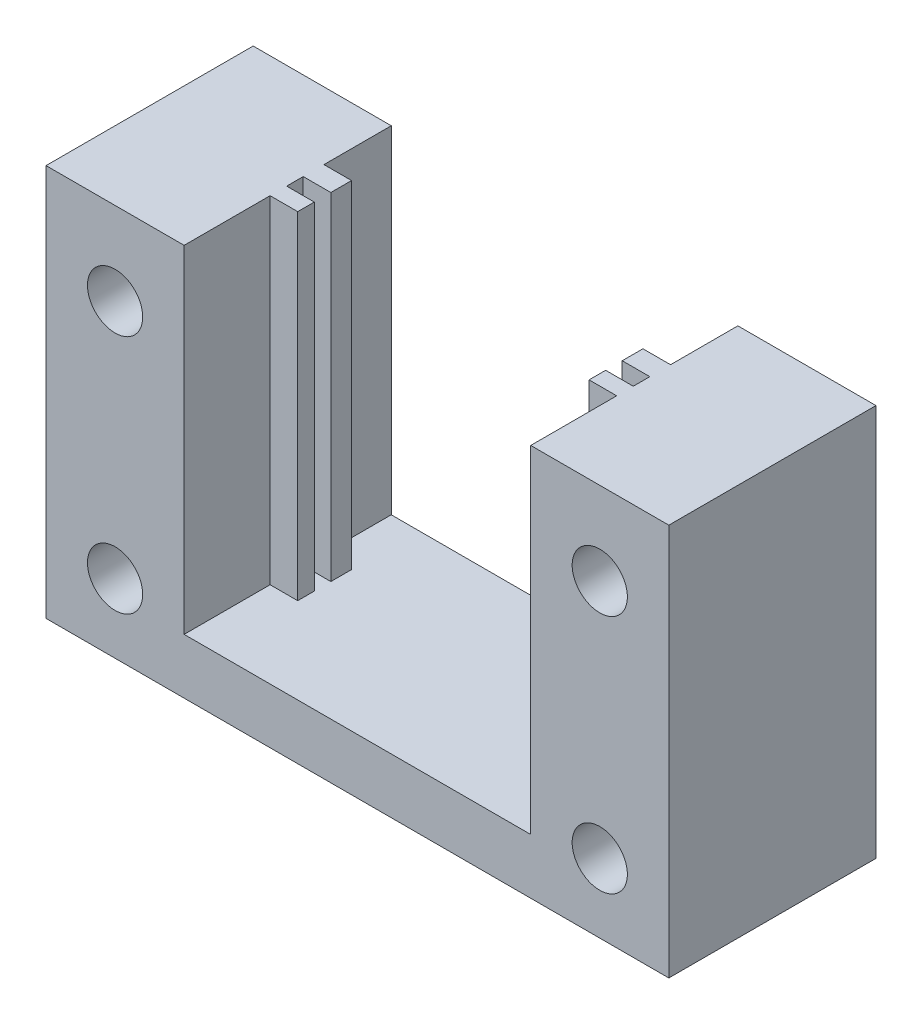
ISO-10303-21;
HEADER;
FILE_DESCRIPTION(('STEP AP214'),'2;1');
FILE_NAME('part.step','',(''),(''),'','','');
FILE_SCHEMA(('AUTOMOTIVE_DESIGN { 1 0 10303 214 1 1 1 1 }'));
ENDSEC;
DATA;
#1=APPLICATION_CONTEXT('core data for automotive mechanical design processes');
#2=APPLICATION_PROTOCOL_DEFINITION('international standard','automotive_design',2000,#1);
#3=PRODUCT_CONTEXT('',#1,'mechanical');
#4=PRODUCT('Part','Part','',(#3));
#5=PRODUCT_RELATED_PRODUCT_CATEGORY('part','',(#4));
#6=PRODUCT_DEFINITION_FORMATION('','',#4);
#7=PRODUCT_DEFINITION_CONTEXT('part definition',#1,'design');
#8=PRODUCT_DEFINITION('design','',#6,#7);
#9=PRODUCT_DEFINITION_SHAPE('','',#8);
#10=(LENGTH_UNIT() NAMED_UNIT(*) SI_UNIT(.MILLI.,.METRE.));
#11=(NAMED_UNIT(*) PLANE_ANGLE_UNIT() SI_UNIT($,.RADIAN.));
#12=(NAMED_UNIT(*) SI_UNIT($,.STERADIAN.) SOLID_ANGLE_UNIT());
#13=UNCERTAINTY_MEASURE_WITH_UNIT(LENGTH_MEASURE(1.E-05),#10,'distance_accuracy_value','');
#14=(GEOMETRIC_REPRESENTATION_CONTEXT(3) GLOBAL_UNCERTAINTY_ASSIGNED_CONTEXT((#13)) GLOBAL_UNIT_ASSIGNED_CONTEXT((#10,
#11,#12)) REPRESENTATION_CONTEXT('',''));
#15=CARTESIAN_POINT('',(0.,0.,0.));
#16=DIRECTION('',(0.,0.,1.));
#17=DIRECTION('',(1.,0.,0.));
#18=AXIS2_PLACEMENT_3D('',#15,#16,#17);
#19=CARTESIAN_POINT('',(-17.55,8.9,-47.));
#20=DIRECTION('',(0.,0.,1.));
#21=DIRECTION('',(1.,0.,0.));
#22=AXIS2_PLACEMENT_3D('',#19,#20,#21);
#23=CYLINDRICAL_SURFACE('',#22,2.);
#24=CARTESIAN_POINT('',(-17.55,8.9,0.));
#25=DIRECTION('',(0.,0.,1.));
#26=DIRECTION('',(1.,0.,0.));
#27=AXIS2_PLACEMENT_3D('',#24,#25,#26);
#28=CIRCLE('',#27,2.);
#29=CARTESIAN_POINT('',(-15.55,8.9,0.));
#30=VERTEX_POINT('',#29);
#31=EDGE_CURVE('E690',#30,#30,#28,.F.);
#32=ORIENTED_EDGE('',*,*,#31,.F.);
#33=EDGE_LOOP('',(#32));
#34=FACE_BOUND('',#33,.T.);
#35=CARTESIAN_POINT('',(-17.55,8.9,-12.));
#36=DIRECTION('',(0.,0.,-1.));
#37=DIRECTION('',(-1.,0.,0.));
#38=AXIS2_PLACEMENT_3D('',#35,#36,#37);
#39=CIRCLE('',#38,2.);
#40=CARTESIAN_POINT('',(-19.55,8.9,-12.));
#41=VERTEX_POINT('',#40);
#42=EDGE_CURVE('E39',#41,#41,#39,.F.);
#43=ORIENTED_EDGE('',*,*,#42,.F.);
#44=EDGE_LOOP('',(#43));
#45=FACE_BOUND('',#44,.T.);
#46=ADVANCED_FACE('F35',(#34,#45),#23,.F.);
#47=CARTESIAN_POINT('',(-17.55,-8.5,-47.));
#48=DIRECTION('',(0.,0.,1.));
#49=DIRECTION('',(1.,0.,0.));
#50=AXIS2_PLACEMENT_3D('',#47,#48,#49);
#51=CYLINDRICAL_SURFACE('',#50,2.);
#52=CARTESIAN_POINT('',(-17.55,-8.5,0.));
#53=DIRECTION('',(0.,0.,1.));
#54=DIRECTION('',(1.,0.,0.));
#55=AXIS2_PLACEMENT_3D('',#52,#53,#54);
#56=CIRCLE('',#55,2.);
#57=CARTESIAN_POINT('',(-15.55,-8.5,0.));
#58=VERTEX_POINT('',#57);
#59=EDGE_CURVE('E687',#58,#58,#56,.F.);
#60=ORIENTED_EDGE('',*,*,#59,.F.);
#61=EDGE_LOOP('',(#60));
#62=FACE_BOUND('',#61,.T.);
#63=CARTESIAN_POINT('',(-17.55,-8.5,-12.));
#64=DIRECTION('',(0.,0.,-1.));
#65=DIRECTION('',(-1.,0.,0.));
#66=AXIS2_PLACEMENT_3D('',#63,#64,#65);
#67=CIRCLE('',#66,2.);
#68=CARTESIAN_POINT('',(-19.55,-8.5,-12.));
#69=VERTEX_POINT('',#68);
#70=EDGE_CURVE('E257',#69,#69,#67,.F.);
#71=ORIENTED_EDGE('',*,*,#70,.F.);
#72=EDGE_LOOP('',(#71));
#73=FACE_BOUND('',#72,.T.);
#74=ADVANCED_FACE('F267',(#62,#73),#51,.F.);
#75=CARTESIAN_POINT('',(17.55,-8.5,-47.));
#76=DIRECTION('',(0.,0.,1.));
#77=DIRECTION('',(1.,0.,0.));
#78=AXIS2_PLACEMENT_3D('',#75,#76,#77);
#79=CYLINDRICAL_SURFACE('',#78,2.);
#80=CARTESIAN_POINT('',(17.55,-8.5,0.));
#81=DIRECTION('',(0.,0.,1.));
#82=DIRECTION('',(1.,0.,0.));
#83=AXIS2_PLACEMENT_3D('',#80,#81,#82);
#84=CIRCLE('',#83,2.);
#85=CARTESIAN_POINT('',(19.55,-8.5,0.));
#86=VERTEX_POINT('',#85);
#87=EDGE_CURVE('E250',#86,#86,#84,.F.);
#88=ORIENTED_EDGE('',*,*,#87,.F.);
#89=EDGE_LOOP('',(#88));
#90=FACE_BOUND('',#89,.T.);
#91=CARTESIAN_POINT('',(17.55,-8.5,-12.));
#92=DIRECTION('',(0.,0.,-1.));
#93=DIRECTION('',(-1.,0.,0.));
#94=AXIS2_PLACEMENT_3D('',#91,#92,#93);
#95=CIRCLE('',#94,2.);
#96=CARTESIAN_POINT('',(15.55,-8.5,-12.));
#97=VERTEX_POINT('',#96);
#98=EDGE_CURVE('E254',#97,#97,#95,.F.);
#99=ORIENTED_EDGE('',*,*,#98,.F.);
#100=EDGE_LOOP('',(#99));
#101=FACE_BOUND('',#100,.T.);
#102=ADVANCED_FACE('F273',(#90,#101),#79,.F.);
#103=CARTESIAN_POINT('',(17.55,8.9,-47.));
#104=DIRECTION('',(0.,0.,1.));
#105=DIRECTION('',(1.,0.,0.));
#106=AXIS2_PLACEMENT_3D('',#103,#104,#105);
#107=CYLINDRICAL_SURFACE('',#106,2.);
#108=CARTESIAN_POINT('',(17.55,8.9,0.));
#109=DIRECTION('',(0.,0.,1.));
#110=DIRECTION('',(1.,0.,0.));
#111=AXIS2_PLACEMENT_3D('',#108,#109,#110);
#112=CIRCLE('',#111,2.);
#113=CARTESIAN_POINT('',(19.55,8.9,0.));
#114=VERTEX_POINT('',#113);
#115=EDGE_CURVE('E247',#114,#114,#112,.F.);
#116=ORIENTED_EDGE('',*,*,#115,.F.);
#117=EDGE_LOOP('',(#116));
#118=FACE_BOUND('',#117,.T.);
#119=CARTESIAN_POINT('',(17.55,8.9,-12.));
#120=DIRECTION('',(0.,0.,-1.));
#121=DIRECTION('',(-1.,0.,0.));
#122=AXIS2_PLACEMENT_3D('',#119,#120,#121);
#123=CIRCLE('',#122,2.);
#124=CARTESIAN_POINT('',(15.55,8.9,-12.));
#125=VERTEX_POINT('',#124);
#126=EDGE_CURVE('E251',#125,#125,#123,.F.);
#127=ORIENTED_EDGE('',*,*,#126,.F.);
#128=EDGE_LOOP('',(#127));
#129=FACE_BOUND('',#128,.T.);
#130=ADVANCED_FACE('F279',(#118,#129),#107,.F.);
#131=CARTESIAN_POINT('',(0.,-9.5,-15.));
#132=DIRECTION('',(0.,1.,0.));
#133=DIRECTION('',(0.,0.,1.));
#134=AXIS2_PLACEMENT_3D('',#131,#132,#133);
#135=PLANE('',#134);
#136=DIRECTION('',(0.,0.,1.));
#137=VECTOR('',#136,1.);
#138=CARTESIAN_POINT('',(10.55,-9.50000000000001,-7.425));
#139=LINE('',#138,#137);
#140=CARTESIAN_POINT('',(10.55,-9.50000000000001,-7.425));
#141=VERTEX_POINT('',#140);
#142=CARTESIAN_POINT('',(10.55,-9.50000000000001,-6.225));
#143=VERTEX_POINT('',#142);
#144=EDGE_CURVE('E696',#141,#143,#139,.T.);
#145=ORIENTED_EDGE('',*,*,#144,.F.);
#146=DIRECTION('',(1.,0.,0.));
#147=VECTOR('',#146,1.);
#148=CARTESIAN_POINT('',(10.55,-9.50000000000001,-7.425));
#149=LINE('',#148,#147);
#150=CARTESIAN_POINT('',(12.55,-9.50000000000001,-7.425));
#151=VERTEX_POINT('',#150);
#152=EDGE_CURVE('E453',#141,#151,#149,.T.);
#153=ORIENTED_EDGE('',*,*,#152,.T.);
#154=DIRECTION('',(0.,0.,1.));
#155=VECTOR('',#154,1.);
#156=CARTESIAN_POINT('',(12.55,-9.5,-15.));
#157=LINE('',#156,#155);
#158=CARTESIAN_POINT('',(12.55,-9.5,-8.625));
#159=VERTEX_POINT('',#158);
#160=EDGE_CURVE('E406',#159,#151,#157,.T.);
#161=ORIENTED_EDGE('',*,*,#160,.F.);
#162=DIRECTION('',(1.,0.,0.));
#163=VECTOR('',#162,1.);
#164=CARTESIAN_POINT('',(10.55,-9.5,-8.625));
#165=LINE('',#164,#163);
#166=CARTESIAN_POINT('',(10.55,-9.5,-8.625));
#167=VERTEX_POINT('',#166);
#168=EDGE_CURVE('E467',#167,#159,#165,.T.);
#169=ORIENTED_EDGE('',*,*,#168,.F.);
#170=DIRECTION('',(0.,0.,1.));
#171=VECTOR('',#170,1.);
#172=CARTESIAN_POINT('',(10.55,-9.50000000000001,-10.125));
#173=LINE('',#172,#171);
#174=CARTESIAN_POINT('',(10.55,-9.50000000000001,-10.125));
#175=VERTEX_POINT('',#174);
#176=EDGE_CURVE('E710',#175,#167,#173,.T.);
#177=ORIENTED_EDGE('',*,*,#176,.F.);
#178=DIRECTION('',(1.,0.,0.));
#179=VECTOR('',#178,1.);
#180=CARTESIAN_POINT('',(10.55,-9.50000000000001,-10.125));
#181=LINE('',#180,#179);
#182=CARTESIAN_POINT('',(12.55,-9.50000000000001,-10.125));
#183=VERTEX_POINT('',#182);
#184=EDGE_CURVE('E469',#175,#183,#181,.T.);
#185=ORIENTED_EDGE('',*,*,#184,.T.);
#186=CARTESIAN_POINT('',(12.55,-9.5,-15.));
#187=VERTEX_POINT('',#186);
#188=EDGE_CURVE('E403',#187,#183,#157,.T.);
#189=ORIENTED_EDGE('',*,*,#188,.F.);
#190=DIRECTION('',(-1.,0.,0.));
#191=VECTOR('',#190,1.);
#192=CARTESIAN_POINT('',(0.,-9.5,-15.));
#193=LINE('',#192,#191);
#194=CARTESIAN_POINT('',(-12.55,-9.5,-15.));
#195=VERTEX_POINT('',#194);
#196=EDGE_CURVE('E383',#187,#195,#193,.T.);
#197=ORIENTED_EDGE('',*,*,#196,.T.);
#198=DIRECTION('',(0.,0.,1.));
#199=VECTOR('',#198,1.);
#200=CARTESIAN_POINT('',(-12.55,-9.5,-15.));
#201=LINE('',#200,#199);
#202=CARTESIAN_POINT('',(-12.55,-9.5,-10.125));
#203=VERTEX_POINT('',#202);
#204=EDGE_CURVE('E407',#195,#203,#201,.T.);
#205=ORIENTED_EDGE('',*,*,#204,.T.);
#206=DIRECTION('',(-1.,0.,0.));
#207=VECTOR('',#206,1.);
#208=CARTESIAN_POINT('',(0.,-9.5,-10.125));
#209=LINE('',#208,#207);
#210=CARTESIAN_POINT('',(-10.55,-9.5,-10.125));
#211=VERTEX_POINT('',#210);
#212=EDGE_CURVE('E482',#211,#203,#209,.T.);
#213=ORIENTED_EDGE('',*,*,#212,.F.);
#214=DIRECTION('',(0.,0.,-1.));
#215=VECTOR('',#214,1.);
#216=CARTESIAN_POINT('',(-10.55,-9.5,-15.));
#217=LINE('',#216,#215);
#218=CARTESIAN_POINT('',(-10.55,-9.5,-8.625));
#219=VERTEX_POINT('',#218);
#220=EDGE_CURVE('E438',#219,#211,#217,.T.);
#221=ORIENTED_EDGE('',*,*,#220,.F.);
#222=DIRECTION('',(-1.,0.,0.));
#223=VECTOR('',#222,1.);
#224=CARTESIAN_POINT('',(0.,-9.5,-8.625));
#225=LINE('',#224,#223);
#226=CARTESIAN_POINT('',(-12.55,-9.5,-8.625));
#227=VERTEX_POINT('',#226);
#228=EDGE_CURVE('E490',#219,#227,#225,.T.);
#229=ORIENTED_EDGE('',*,*,#228,.T.);
#230=CARTESIAN_POINT('',(-12.55,-9.5,-7.425));
#231=VERTEX_POINT('',#230);
#232=EDGE_CURVE('E409',#227,#231,#201,.T.);
#233=ORIENTED_EDGE('',*,*,#232,.T.);
#234=DIRECTION('',(-1.,0.,0.));
#235=VECTOR('',#234,1.);
#236=CARTESIAN_POINT('',(0.,-9.5,-7.425));
#237=LINE('',#236,#235);
#238=CARTESIAN_POINT('',(-10.55,-9.5,-7.425));
#239=VERTEX_POINT('',#238);
#240=EDGE_CURVE('E44',#239,#231,#237,.T.);
#241=ORIENTED_EDGE('',*,*,#240,.F.);
#242=DIRECTION('',(0.,0.,1.));
#243=VECTOR('',#242,1.);
#244=CARTESIAN_POINT('',(-10.55,-9.5,-15.));
#245=LINE('',#244,#243);
#246=CARTESIAN_POINT('',(-10.55,-9.5,-6.225));
#247=VERTEX_POINT('',#246);
#248=EDGE_CURVE('E242',#239,#247,#245,.T.);
#249=ORIENTED_EDGE('',*,*,#248,.T.);
#250=DIRECTION('',(-1.,0.,0.));
#251=VECTOR('',#250,1.);
#252=CARTESIAN_POINT('',(0.,-9.5,-6.225));
#253=LINE('',#252,#251);
#254=CARTESIAN_POINT('',(-12.55,-9.5,-6.225));
#255=VERTEX_POINT('',#254);
#256=EDGE_CURVE('E11',#247,#255,#253,.T.);
#257=ORIENTED_EDGE('',*,*,#256,.T.);
#258=CARTESIAN_POINT('',(-12.55,-9.5,0.));
#259=VERTEX_POINT('',#258);
#260=EDGE_CURVE('E405',#255,#259,#201,.T.);
#261=ORIENTED_EDGE('',*,*,#260,.T.);
#262=DIRECTION('',(-1.,0.,0.));
#263=VECTOR('',#262,1.);
#264=CARTESIAN_POINT('',(0.,-9.5,0.));
#265=LINE('',#264,#263);
#266=CARTESIAN_POINT('',(12.55,-9.5,0.));
#267=VERTEX_POINT('',#266);
#268=EDGE_CURVE('E394',#267,#259,#265,.T.);
#269=ORIENTED_EDGE('',*,*,#268,.F.);
#270=CARTESIAN_POINT('',(12.55,-9.50000000000001,-6.225));
#271=VERTEX_POINT('',#270);
#272=EDGE_CURVE('E401',#271,#267,#157,.T.);
#273=ORIENTED_EDGE('',*,*,#272,.F.);
#274=DIRECTION('',(1.,0.,0.));
#275=VECTOR('',#274,1.);
#276=CARTESIAN_POINT('',(10.55,-9.50000000000001,-6.225));
#277=LINE('',#276,#275);
#278=EDGE_CURVE('E458',#143,#271,#277,.T.);
#279=ORIENTED_EDGE('',*,*,#278,.F.);
#280=EDGE_LOOP('',(#145,#153,#161,#169,#177,#185,#189,#197,#205,#213,#221,#229,#233,#241,#249,
#257,#261,#269,#273,#279));
#281=FACE_BOUND('',#280,.T.);
#282=ADVANCED_FACE('F341',(#281),#135,.T.);
#283=CARTESIAN_POINT('',(12.55,0.,-15.));
#284=DIRECTION('',(-1.,0.,0.));
#285=DIRECTION('',(0.,-1.,0.));
#286=AXIS2_PLACEMENT_3D('',#283,#284,#285);
#287=PLANE('',#286);
#288=ORIENTED_EDGE('',*,*,#160,.T.);
#289=DIRECTION('',(0.,-1.,0.));
#290=VECTOR('',#289,1.);
#291=CARTESIAN_POINT('',(12.55,14.9,-7.425));
#292=LINE('',#291,#290);
#293=CARTESIAN_POINT('',(12.55,14.9,-7.425));
#294=VERTEX_POINT('',#293);
#295=EDGE_CURVE('E693',#294,#151,#292,.T.);
#296=ORIENTED_EDGE('',*,*,#295,.F.);
#297=DIRECTION('',(0.,0.,1.));
#298=VECTOR('',#297,1.);
#299=CARTESIAN_POINT('',(12.55,14.9,-15.));
#300=LINE('',#299,#298);
#301=CARTESIAN_POINT('',(12.55,14.9,-8.62500000000001));
#302=VERTEX_POINT('',#301);
#303=EDGE_CURVE('E402',#302,#294,#300,.T.);
#304=ORIENTED_EDGE('',*,*,#303,.F.);
#305=DIRECTION('',(0.,1.,0.));
#306=VECTOR('',#305,1.);
#307=CARTESIAN_POINT('',(12.55,14.9,-8.62500000000001));
#308=LINE('',#307,#306);
#309=EDGE_CURVE('E452',#159,#302,#308,.T.);
#310=ORIENTED_EDGE('',*,*,#309,.F.);
#311=EDGE_LOOP('',(#288,#296,#304,#310));
#312=FACE_BOUND('',#311,.T.);
#313=ADVANCED_FACE('F340',(#312),#287,.T.);
#314=CARTESIAN_POINT('',(12.55,14.9,-6.225));
#315=VERTEX_POINT('',#314);
#316=CARTESIAN_POINT('',(12.55,14.9,0.));
#317=VERTEX_POINT('',#316);
#318=EDGE_CURVE('E389',#315,#317,#300,.T.);
#319=ORIENTED_EDGE('',*,*,#318,.F.);
#320=DIRECTION('',(0.,1.,0.));
#321=VECTOR('',#320,1.);
#322=CARTESIAN_POINT('',(12.55,14.9,-6.22500000000001));
#323=LINE('',#322,#321);
#324=EDGE_CURVE('E697',#271,#315,#323,.T.);
#325=ORIENTED_EDGE('',*,*,#324,.F.);
#326=ORIENTED_EDGE('',*,*,#272,.T.);
#327=DIRECTION('',(0.,-1.,0.));
#328=VECTOR('',#327,1.);
#329=CARTESIAN_POINT('',(12.55,0.,0.));
#330=LINE('',#329,#328);
#331=EDGE_CURVE('E396',#317,#267,#330,.T.);
#332=ORIENTED_EDGE('',*,*,#331,.F.);
#333=EDGE_LOOP('',(#319,#325,#326,#332));
#334=FACE_BOUND('',#333,.T.);
#335=ADVANCED_FACE('F338',(#334),#287,.T.);
#336=ORIENTED_EDGE('',*,*,#188,.T.);
#337=DIRECTION('',(0.,-1.,0.));
#338=VECTOR('',#337,1.);
#339=CARTESIAN_POINT('',(12.55,14.9,-10.125));
#340=LINE('',#339,#338);
#341=CARTESIAN_POINT('',(12.55,14.9,-10.125));
#342=VERTEX_POINT('',#341);
#343=EDGE_CURVE('E449',#342,#183,#340,.T.);
#344=ORIENTED_EDGE('',*,*,#343,.F.);
#345=CARTESIAN_POINT('',(12.55,14.9,-15.));
#346=VERTEX_POINT('',#345);
#347=EDGE_CURVE('E398',#346,#342,#300,.T.);
#348=ORIENTED_EDGE('',*,*,#347,.F.);
#349=DIRECTION('',(0.,-1.,0.));
#350=VECTOR('',#349,1.);
#351=CARTESIAN_POINT('',(12.55,0.,-15.));
#352=LINE('',#351,#350);
#353=EDGE_CURVE('E386',#346,#187,#352,.T.);
#354=ORIENTED_EDGE('',*,*,#353,.T.);
#355=EDGE_LOOP('',(#336,#344,#348,#354));
#356=FACE_BOUND('',#355,.T.);
#357=ADVANCED_FACE('F334',(#356),#287,.T.);
#358=CARTESIAN_POINT('',(-12.55,0.,-15.));
#359=DIRECTION('',(-1.,0.,0.));
#360=DIRECTION('',(0.,-1.,0.));
#361=AXIS2_PLACEMENT_3D('',#358,#359,#360);
#362=PLANE('',#361);
#363=DIRECTION('',(0.,-1.,0.));
#364=VECTOR('',#363,1.);
#365=CARTESIAN_POINT('',(-12.55,14.9,-8.625));
#366=LINE('',#365,#364);
#367=CARTESIAN_POINT('',(-12.55,14.9,-8.625));
#368=VERTEX_POINT('',#367);
#369=EDGE_CURVE('E479',#368,#227,#366,.T.);
#370=ORIENTED_EDGE('',*,*,#369,.F.);
#371=DIRECTION('',(0.,0.,1.));
#372=VECTOR('',#371,1.);
#373=CARTESIAN_POINT('',(-12.55,14.9,-15.));
#374=LINE('',#373,#372);
#375=CARTESIAN_POINT('',(-12.55,14.9,-7.425));
#376=VERTEX_POINT('',#375);
#377=EDGE_CURVE('E232',#368,#376,#374,.T.);
#378=ORIENTED_EDGE('',*,*,#377,.T.);
#379=DIRECTION('',(0.,-1.,0.));
#380=VECTOR('',#379,1.);
#381=CARTESIAN_POINT('',(-12.55,14.9,-7.425));
#382=LINE('',#381,#380);
#383=EDGE_CURVE('E435',#376,#231,#382,.T.);
#384=ORIENTED_EDGE('',*,*,#383,.T.);
#385=ORIENTED_EDGE('',*,*,#232,.F.);
#386=EDGE_LOOP('',(#370,#378,#384,#385));
#387=FACE_BOUND('',#386,.T.);
#388=ADVANCED_FACE('F337',(#387),#362,.F.);
#389=DIRECTION('',(0.,-1.,0.));
#390=VECTOR('',#389,1.);
#391=CARTESIAN_POINT('',(-12.55,14.9,-6.225));
#392=LINE('',#391,#390);
#393=CARTESIAN_POINT('',(-12.55,14.9,-6.225));
#394=VERTEX_POINT('',#393);
#395=EDGE_CURVE('E420',#394,#255,#392,.T.);
#396=ORIENTED_EDGE('',*,*,#395,.F.);
#397=CARTESIAN_POINT('',(-12.55,14.9,0.));
#398=VERTEX_POINT('',#397);
#399=EDGE_CURVE('E234',#394,#398,#374,.T.);
#400=ORIENTED_EDGE('',*,*,#399,.T.);
#401=DIRECTION('',(0.,-1.,0.));
#402=VECTOR('',#401,1.);
#403=CARTESIAN_POINT('',(-12.55,0.,0.));
#404=LINE('',#403,#402);
#405=EDGE_CURVE('E207',#398,#259,#404,.T.);
#406=ORIENTED_EDGE('',*,*,#405,.T.);
#407=ORIENTED_EDGE('',*,*,#260,.F.);
#408=EDGE_LOOP('',(#396,#400,#406,#407));
#409=FACE_BOUND('',#408,.T.);
#410=ADVANCED_FACE('F348',(#409),#362,.F.);
#411=CARTESIAN_POINT('',(0.,14.9,-15.));
#412=DIRECTION('',(0.,1.,0.));
#413=DIRECTION('',(-1.,0.,0.));
#414=AXIS2_PLACEMENT_3D('',#411,#412,#413);
#415=PLANE('',#414);
#416=DIRECTION('',(-1.,0.,0.));
#417=VECTOR('',#416,1.);
#418=CARTESIAN_POINT('',(0.,14.9,0.));
#419=LINE('',#418,#417);
#420=CARTESIAN_POINT('',(22.55,14.9,0.));
#421=VERTEX_POINT('',#420);
#422=EDGE_CURVE('E368',#421,#317,#419,.T.);
#423=ORIENTED_EDGE('',*,*,#422,.F.);
#424=DIRECTION('',(0.,0.,1.));
#425=VECTOR('',#424,1.);
#426=CARTESIAN_POINT('',(22.55,14.9,-15.));
#427=LINE('',#426,#425);
#428=CARTESIAN_POINT('',(22.55,14.9,-15.));
#429=VERTEX_POINT('',#428);
#430=EDGE_CURVE('E239',#429,#421,#427,.T.);
#431=ORIENTED_EDGE('',*,*,#430,.F.);
#432=DIRECTION('',(-1.,0.,0.));
#433=VECTOR('',#432,1.);
#434=CARTESIAN_POINT('',(0.,14.9,-15.));
#435=LINE('',#434,#433);
#436=EDGE_CURVE('E376',#429,#346,#435,.T.);
#437=ORIENTED_EDGE('',*,*,#436,.T.);
#438=ORIENTED_EDGE('',*,*,#347,.T.);
#439=DIRECTION('',(1.,0.,0.));
#440=VECTOR('',#439,1.);
#441=CARTESIAN_POINT('',(10.55,14.9,-10.125));
#442=LINE('',#441,#440);
#443=CARTESIAN_POINT('',(10.55,14.9,-10.125));
#444=VERTEX_POINT('',#443);
#445=EDGE_CURVE('E464',#444,#342,#442,.T.);
#446=ORIENTED_EDGE('',*,*,#445,.F.);
#447=DIRECTION('',(0.,0.,-1.));
#448=VECTOR('',#447,1.);
#449=CARTESIAN_POINT('',(10.55,14.9,-10.125));
#450=LINE('',#449,#448);
#451=CARTESIAN_POINT('',(10.55,14.9,-8.62500000000001));
#452=VERTEX_POINT('',#451);
#453=EDGE_CURVE('E461',#452,#444,#450,.T.);
#454=ORIENTED_EDGE('',*,*,#453,.F.);
#455=DIRECTION('',(1.,0.,0.));
#456=VECTOR('',#455,1.);
#457=CARTESIAN_POINT('',(10.55,14.9,-8.62500000000001));
#458=LINE('',#457,#456);
#459=EDGE_CURVE('E59',#452,#302,#458,.T.);
#460=ORIENTED_EDGE('',*,*,#459,.T.);
#461=ORIENTED_EDGE('',*,*,#303,.T.);
#462=DIRECTION('',(1.,0.,0.));
#463=VECTOR('',#462,1.);
#464=CARTESIAN_POINT('',(10.55,14.9,-7.425));
#465=LINE('',#464,#463);
#466=CARTESIAN_POINT('',(10.55,14.9,-7.425));
#467=VERTEX_POINT('',#466);
#468=EDGE_CURVE('E703',#467,#294,#465,.T.);
#469=ORIENTED_EDGE('',*,*,#468,.F.);
#470=DIRECTION('',(0.,0.,-1.));
#471=VECTOR('',#470,1.);
#472=CARTESIAN_POINT('',(10.55,14.9,-7.425));
#473=LINE('',#472,#471);
#474=CARTESIAN_POINT('',(10.55,14.9,-6.22500000000001));
#475=VERTEX_POINT('',#474);
#476=EDGE_CURVE('E701',#475,#467,#473,.T.);
#477=ORIENTED_EDGE('',*,*,#476,.F.);
#478=DIRECTION('',(1.,0.,0.));
#479=VECTOR('',#478,1.);
#480=CARTESIAN_POINT('',(10.55,14.9,-6.22500000000001));
#481=LINE('',#480,#479);
#482=EDGE_CURVE('E52',#475,#315,#481,.T.);
#483=ORIENTED_EDGE('',*,*,#482,.T.);
#484=ORIENTED_EDGE('',*,*,#318,.T.);
#485=EDGE_LOOP('',(#423,#431,#437,#438,#446,#454,#460,#461,#469,#477,#483,#484));
#486=FACE_BOUND('',#485,.T.);
#487=ADVANCED_FACE('F37',(#486),#415,.T.);
#488=CARTESIAN_POINT('',(22.55,0.,-15.));
#489=DIRECTION('',(-1.,0.,0.));
#490=DIRECTION('',(0.,-1.,0.));
#491=AXIS2_PLACEMENT_3D('',#488,#489,#490);
#492=PLANE('',#491);
#493=DIRECTION('',(0.,-1.,0.));
#494=VECTOR('',#493,1.);
#495=CARTESIAN_POINT('',(22.55,0.,0.));
#496=LINE('',#495,#494);
#497=CARTESIAN_POINT('',(22.55,-13.5,0.));
#498=VERTEX_POINT('',#497);
#499=EDGE_CURVE('E364',#421,#498,#496,.T.);
#500=ORIENTED_EDGE('',*,*,#499,.T.);
#501=DIRECTION('',(0.,0.,1.));
#502=VECTOR('',#501,1.);
#503=CARTESIAN_POINT('',(22.55,-13.5,-15.));
#504=LINE('',#503,#502);
#505=CARTESIAN_POINT('',(22.55,-13.5,-15.));
#506=VERTEX_POINT('',#505);
#507=EDGE_CURVE('E229',#506,#498,#504,.T.);
#508=ORIENTED_EDGE('',*,*,#507,.F.);
#509=DIRECTION('',(0.,-1.,0.));
#510=VECTOR('',#509,1.);
#511=CARTESIAN_POINT('',(22.55,0.,-15.));
#512=LINE('',#511,#510);
#513=EDGE_CURVE('E373',#429,#506,#512,.T.);
#514=ORIENTED_EDGE('',*,*,#513,.F.);
#515=ORIENTED_EDGE('',*,*,#430,.T.);
#516=EDGE_LOOP('',(#500,#508,#514,#515));
#517=FACE_BOUND('',#516,.T.);
#518=ADVANCED_FACE('F355',(#517),#492,.F.);
#519=CARTESIAN_POINT('',(0.,-13.5,-15.));
#520=DIRECTION('',(0.,1.,0.));
#521=DIRECTION('',(0.,0.,1.));
#522=AXIS2_PLACEMENT_3D('',#519,#520,#521);
#523=PLANE('',#522);
#524=DIRECTION('',(-1.,0.,0.));
#525=VECTOR('',#524,1.);
#526=CARTESIAN_POINT('',(0.,-13.5,0.));
#527=LINE('',#526,#525);
#528=CARTESIAN_POINT('',(-22.55,-13.5,0.));
#529=VERTEX_POINT('',#528);
#530=EDGE_CURVE('E222',#498,#529,#527,.T.);
#531=ORIENTED_EDGE('',*,*,#530,.T.);
#532=DIRECTION('',(0.,0.,1.));
#533=VECTOR('',#532,1.);
#534=CARTESIAN_POINT('',(-22.55,-13.5,-15.));
#535=LINE('',#534,#533);
#536=CARTESIAN_POINT('',(-22.55,-13.5,-15.));
#537=VERTEX_POINT('',#536);
#538=EDGE_CURVE('E221',#537,#529,#535,.T.);
#539=ORIENTED_EDGE('',*,*,#538,.F.);
#540=DIRECTION('',(-1.,0.,0.));
#541=VECTOR('',#540,1.);
#542=CARTESIAN_POINT('',(0.,-13.5,-15.));
#543=LINE('',#542,#541);
#544=EDGE_CURVE('E370',#506,#537,#543,.T.);
#545=ORIENTED_EDGE('',*,*,#544,.F.);
#546=ORIENTED_EDGE('',*,*,#507,.T.);
#547=EDGE_LOOP('',(#531,#539,#545,#546));
#548=FACE_BOUND('',#547,.T.);
#549=ADVANCED_FACE('F353',(#548),#523,.F.);
#550=CARTESIAN_POINT('',(-22.55,0.,-15.));
#551=DIRECTION('',(1.,0.,0.));
#552=DIRECTION('',(0.,0.,-1.));
#553=AXIS2_PLACEMENT_3D('',#550,#551,#552);
#554=PLANE('',#553);
#555=DIRECTION('',(0.,1.,0.));
#556=VECTOR('',#555,1.);
#557=CARTESIAN_POINT('',(-22.55,0.,0.));
#558=LINE('',#557,#556);
#559=CARTESIAN_POINT('',(-22.55,14.9,0.));
#560=VERTEX_POINT('',#559);
#561=EDGE_CURVE('E204',#529,#560,#558,.T.);
#562=ORIENTED_EDGE('',*,*,#561,.T.);
#563=DIRECTION('',(0.,0.,1.));
#564=VECTOR('',#563,1.);
#565=CARTESIAN_POINT('',(-22.55,14.9,-15.));
#566=LINE('',#565,#564);
#567=CARTESIAN_POINT('',(-22.55,14.9,-15.));
#568=VERTEX_POINT('',#567);
#569=EDGE_CURVE('E218',#568,#560,#566,.T.);
#570=ORIENTED_EDGE('',*,*,#569,.F.);
#571=DIRECTION('',(0.,1.,0.));
#572=VECTOR('',#571,1.);
#573=CARTESIAN_POINT('',(-22.55,0.,-15.));
#574=LINE('',#573,#572);
#575=EDGE_CURVE('E372',#537,#568,#574,.T.);
#576=ORIENTED_EDGE('',*,*,#575,.F.);
#577=ORIENTED_EDGE('',*,*,#538,.T.);
#578=EDGE_LOOP('',(#562,#570,#576,#577));
#579=FACE_BOUND('',#578,.T.);
#580=ADVANCED_FACE('F216',(#579),#554,.F.);
#581=CARTESIAN_POINT('',(0.,14.9,-15.));
#582=DIRECTION('',(0.,-1.,0.));
#583=DIRECTION('',(1.,0.,0.));
#584=AXIS2_PLACEMENT_3D('',#581,#582,#583);
#585=PLANE('',#584);
#586=DIRECTION('',(1.,0.,0.));
#587=VECTOR('',#586,1.);
#588=CARTESIAN_POINT('',(0.,14.9,0.));
#589=LINE('',#588,#587);
#590=EDGE_CURVE('E200',#560,#398,#589,.T.);
#591=ORIENTED_EDGE('',*,*,#590,.T.);
#592=ORIENTED_EDGE('',*,*,#399,.F.);
#593=DIRECTION('',(-1.,0.,0.));
#594=VECTOR('',#593,1.);
#595=CARTESIAN_POINT('',(-10.55,14.9,-6.225));
#596=LINE('',#595,#594);
#597=CARTESIAN_POINT('',(-10.55,14.9,-6.225));
#598=VERTEX_POINT('',#597);
#599=EDGE_CURVE('E390',#598,#394,#596,.T.);
#600=ORIENTED_EDGE('',*,*,#599,.F.);
#601=DIRECTION('',(0.,0.,-1.));
#602=VECTOR('',#601,1.);
#603=CARTESIAN_POINT('',(-10.55,14.9,-6.225));
#604=LINE('',#603,#602);
#605=CARTESIAN_POINT('',(-10.55,14.9,-7.425));
#606=VERTEX_POINT('',#605);
#607=EDGE_CURVE('E425',#598,#606,#604,.T.);
#608=ORIENTED_EDGE('',*,*,#607,.T.);
#609=DIRECTION('',(-1.,0.,0.));
#610=VECTOR('',#609,1.);
#611=CARTESIAN_POINT('',(-10.55,14.9,-7.425));
#612=LINE('',#611,#610);
#613=EDGE_CURVE('E426',#606,#376,#612,.T.);
#614=ORIENTED_EDGE('',*,*,#613,.T.);
#615=ORIENTED_EDGE('',*,*,#377,.F.);
#616=DIRECTION('',(-1.,0.,0.));
#617=VECTOR('',#616,1.);
#618=CARTESIAN_POINT('',(-10.55,14.9,-8.625));
#619=LINE('',#618,#617);
#620=CARTESIAN_POINT('',(-10.55,14.9,-8.625));
#621=VERTEX_POINT('',#620);
#622=EDGE_CURVE('E471',#621,#368,#619,.T.);
#623=ORIENTED_EDGE('',*,*,#622,.F.);
#624=DIRECTION('',(0.,0.,1.));
#625=VECTOR('',#624,1.);
#626=CARTESIAN_POINT('',(-10.55,14.9,-10.125));
#627=LINE('',#626,#625);
#628=CARTESIAN_POINT('',(-10.55,14.9,-10.125));
#629=VERTEX_POINT('',#628);
#630=EDGE_CURVE('E480',#629,#621,#627,.T.);
#631=ORIENTED_EDGE('',*,*,#630,.F.);
#632=DIRECTION('',(-1.,0.,0.));
#633=VECTOR('',#632,1.);
#634=CARTESIAN_POINT('',(-10.55,14.9,-10.125));
#635=LINE('',#634,#633);
#636=CARTESIAN_POINT('',(-12.55,14.9,-10.125));
#637=VERTEX_POINT('',#636);
#638=EDGE_CURVE('E473',#629,#637,#635,.T.);
#639=ORIENTED_EDGE('',*,*,#638,.T.);
#640=CARTESIAN_POINT('',(-12.55,14.9,-15.));
#641=VERTEX_POINT('',#640);
#642=EDGE_CURVE('E227',#641,#637,#374,.T.);
#643=ORIENTED_EDGE('',*,*,#642,.F.);
#644=DIRECTION('',(1.,0.,0.));
#645=VECTOR('',#644,1.);
#646=CARTESIAN_POINT('',(0.,14.9,-15.));
#647=LINE('',#646,#645);
#648=EDGE_CURVE('E226',#568,#641,#647,.T.);
#649=ORIENTED_EDGE('',*,*,#648,.F.);
#650=ORIENTED_EDGE('',*,*,#569,.T.);
#651=EDGE_LOOP('',(#591,#592,#600,#608,#614,#615,#623,#631,#639,#643,#649,#650));
#652=FACE_BOUND('',#651,.T.);
#653=ADVANCED_FACE('F224',(#652),#585,.F.);
#654=ORIENTED_EDGE('',*,*,#642,.T.);
#655=DIRECTION('',(0.,-1.,0.));
#656=VECTOR('',#655,1.);
#657=CARTESIAN_POINT('',(-12.55,14.9,-10.125));
#658=LINE('',#657,#656);
#659=EDGE_CURVE('E476',#637,#203,#658,.T.);
#660=ORIENTED_EDGE('',*,*,#659,.T.);
#661=ORIENTED_EDGE('',*,*,#204,.F.);
#662=DIRECTION('',(0.,-1.,0.));
#663=VECTOR('',#662,1.);
#664=CARTESIAN_POINT('',(-12.55,0.,-15.));
#665=LINE('',#664,#663);
#666=EDGE_CURVE('E381',#641,#195,#665,.T.);
#667=ORIENTED_EDGE('',*,*,#666,.F.);
#668=EDGE_LOOP('',(#654,#660,#661,#667));
#669=FACE_BOUND('',#668,.T.);
#670=ADVANCED_FACE('F332',(#669),#362,.F.);
#671=CARTESIAN_POINT('',(0.,0.,-15.));
#672=DIRECTION('',(0.,0.,-1.));
#673=DIRECTION('',(-1.,0.,0.));
#674=AXIS2_PLACEMENT_3D('',#671,#672,#673);
#675=PLANE('',#674);
#676=CARTESIAN_POINT('',(-17.55,-8.5,-15.));
#677=DIRECTION('',(0.,0.,-1.));
#678=DIRECTION('',(-1.,0.,0.));
#679=AXIS2_PLACEMENT_3D('',#676,#677,#678);
#680=CIRCLE('',#679,3.5);
#681=CARTESIAN_POINT('',(-21.05,-8.5,-15.));
#682=VERTEX_POINT('',#681);
#683=EDGE_CURVE('E673',#682,#682,#680,.T.);
#684=ORIENTED_EDGE('',*,*,#683,.F.);
#685=EDGE_LOOP('',(#684));
#686=FACE_BOUND('',#685,.T.);
#687=CARTESIAN_POINT('',(-17.55,8.9,-15.));
#688=DIRECTION('',(0.,0.,-1.));
#689=DIRECTION('',(-1.,0.,0.));
#690=AXIS2_PLACEMENT_3D('',#687,#688,#689);
#691=CIRCLE('',#690,3.5);
#692=CARTESIAN_POINT('',(-21.05,8.9,-15.));
#693=VERTEX_POINT('',#692);
#694=EDGE_CURVE('E675',#693,#693,#691,.T.);
#695=ORIENTED_EDGE('',*,*,#694,.F.);
#696=EDGE_LOOP('',(#695));
#697=FACE_BOUND('',#696,.T.);
#698=CARTESIAN_POINT('',(17.55,8.9,-15.));
#699=DIRECTION('',(0.,0.,-1.));
#700=DIRECTION('',(-1.,0.,0.));
#701=AXIS2_PLACEMENT_3D('',#698,#699,#700);
#702=CIRCLE('',#701,3.5);
#703=CARTESIAN_POINT('',(14.05,8.9,-15.));
#704=VERTEX_POINT('',#703);
#705=EDGE_CURVE('E857',#704,#704,#702,.T.);
#706=ORIENTED_EDGE('',*,*,#705,.F.);
#707=EDGE_LOOP('',(#706));
#708=FACE_BOUND('',#707,.T.);
#709=CARTESIAN_POINT('',(17.55,-8.5,-15.));
#710=DIRECTION('',(0.,0.,-1.));
#711=DIRECTION('',(-1.,0.,0.));
#712=AXIS2_PLACEMENT_3D('',#709,#710,#711);
#713=CIRCLE('',#712,3.5);
#714=CARTESIAN_POINT('',(14.05,-8.5,-15.));
#715=VERTEX_POINT('',#714);
#716=EDGE_CURVE('E681',#715,#715,#713,.T.);
#717=ORIENTED_EDGE('',*,*,#716,.F.);
#718=EDGE_LOOP('',(#717));
#719=FACE_BOUND('',#718,.T.);
#720=ORIENTED_EDGE('',*,*,#436,.F.);
#721=ORIENTED_EDGE('',*,*,#513,.T.);
#722=ORIENTED_EDGE('',*,*,#544,.T.);
#723=ORIENTED_EDGE('',*,*,#575,.T.);
#724=ORIENTED_EDGE('',*,*,#648,.T.);
#725=ORIENTED_EDGE('',*,*,#666,.T.);
#726=ORIENTED_EDGE('',*,*,#196,.F.);
#727=ORIENTED_EDGE('',*,*,#353,.F.);
#728=EDGE_LOOP('',(#720,#721,#722,#723,#724,#725,#726,#727));
#729=FACE_BOUND('',#728,.T.);
#730=ADVANCED_FACE('F325',(#686,#697,#708,#719,#729),#675,.T.);
#731=CARTESIAN_POINT('',(-10.55,14.9,-6.225));
#732=DIRECTION('',(0.,0.,-1.));
#733=DIRECTION('',(0.,1.,0.));
#734=AXIS2_PLACEMENT_3D('',#731,#732,#733);
#735=PLANE('',#734);
#736=ORIENTED_EDGE('',*,*,#256,.F.);
#737=DIRECTION('',(0.,-1.,0.));
#738=VECTOR('',#737,1.);
#739=CARTESIAN_POINT('',(-10.55,14.9,-6.225));
#740=LINE('',#739,#738);
#741=EDGE_CURVE('E428',#598,#247,#740,.T.);
#742=ORIENTED_EDGE('',*,*,#741,.F.);
#743=ORIENTED_EDGE('',*,*,#599,.T.);
#744=ORIENTED_EDGE('',*,*,#395,.T.);
#745=EDGE_LOOP('',(#736,#742,#743,#744));
#746=FACE_BOUND('',#745,.T.);
#747=ADVANCED_FACE('F322',(#746),#735,.F.);
#748=CARTESIAN_POINT('',(-10.55,14.9,-7.425));
#749=DIRECTION('',(0.,0.,-1.));
#750=DIRECTION('',(0.,1.,0.));
#751=AXIS2_PLACEMENT_3D('',#748,#749,#750);
#752=PLANE('',#751);
#753=DIRECTION('',(0.,-1.,0.));
#754=VECTOR('',#753,1.);
#755=CARTESIAN_POINT('',(-10.55,14.9,-7.425));
#756=LINE('',#755,#754);
#757=EDGE_CURVE('E429',#606,#239,#756,.T.);
#758=ORIENTED_EDGE('',*,*,#757,.T.);
#759=ORIENTED_EDGE('',*,*,#240,.T.);
#760=ORIENTED_EDGE('',*,*,#383,.F.);
#761=ORIENTED_EDGE('',*,*,#613,.F.);
#762=EDGE_LOOP('',(#758,#759,#760,#761));
#763=FACE_BOUND('',#762,.T.);
#764=ADVANCED_FACE('F320',(#763),#752,.T.);
#765=CARTESIAN_POINT('',(-10.55,0.,0.));
#766=DIRECTION('',(-1.,0.,0.));
#767=DIRECTION('',(0.,-1.,0.));
#768=AXIS2_PLACEMENT_3D('',#765,#766,#767);
#769=PLANE('',#768);
#770=ORIENTED_EDGE('',*,*,#248,.F.);
#771=ORIENTED_EDGE('',*,*,#757,.F.);
#772=ORIENTED_EDGE('',*,*,#607,.F.);
#773=ORIENTED_EDGE('',*,*,#741,.T.);
#774=EDGE_LOOP('',(#770,#771,#772,#773));
#775=FACE_BOUND('',#774,.T.);
#776=ADVANCED_FACE('F310',(#775),#769,.F.);
#777=CARTESIAN_POINT('',(-10.55,14.9,-8.625));
#778=DIRECTION('',(0.,0.,-1.));
#779=DIRECTION('',(0.,1.,0.));
#780=AXIS2_PLACEMENT_3D('',#777,#778,#779);
#781=PLANE('',#780);
#782=ORIENTED_EDGE('',*,*,#228,.F.);
#783=DIRECTION('',(0.,-1.,0.));
#784=VECTOR('',#783,1.);
#785=CARTESIAN_POINT('',(-10.55,14.9,-8.625));
#786=LINE('',#785,#784);
#787=EDGE_CURVE('E485',#621,#219,#786,.T.);
#788=ORIENTED_EDGE('',*,*,#787,.F.);
#789=ORIENTED_EDGE('',*,*,#622,.T.);
#790=ORIENTED_EDGE('',*,*,#369,.T.);
#791=EDGE_LOOP('',(#782,#788,#789,#790));
#792=FACE_BOUND('',#791,.T.);
#793=ADVANCED_FACE('F306',(#792),#781,.F.);
#794=CARTESIAN_POINT('',(-10.55,14.9,-10.125));
#795=DIRECTION('',(0.,0.,-1.));
#796=DIRECTION('',(0.,1.,0.));
#797=AXIS2_PLACEMENT_3D('',#794,#795,#796);
#798=PLANE('',#797);
#799=DIRECTION('',(0.,-1.,0.));
#800=VECTOR('',#799,1.);
#801=CARTESIAN_POINT('',(-10.55,14.9,-10.125));
#802=LINE('',#801,#800);
#803=EDGE_CURVE('E475',#629,#211,#802,.T.);
#804=ORIENTED_EDGE('',*,*,#803,.T.);
#805=ORIENTED_EDGE('',*,*,#212,.T.);
#806=ORIENTED_EDGE('',*,*,#659,.F.);
#807=ORIENTED_EDGE('',*,*,#638,.F.);
#808=EDGE_LOOP('',(#804,#805,#806,#807));
#809=FACE_BOUND('',#808,.T.);
#810=ADVANCED_FACE('F309',(#809),#798,.T.);
#811=CARTESIAN_POINT('',(-10.55,0.,0.));
#812=DIRECTION('',(1.,0.,0.));
#813=DIRECTION('',(0.,1.,0.));
#814=AXIS2_PLACEMENT_3D('',#811,#812,#813);
#815=PLANE('',#814);
#816=ORIENTED_EDGE('',*,*,#787,.T.);
#817=ORIENTED_EDGE('',*,*,#220,.T.);
#818=ORIENTED_EDGE('',*,*,#803,.F.);
#819=ORIENTED_EDGE('',*,*,#630,.T.);
#820=EDGE_LOOP('',(#816,#817,#818,#819));
#821=FACE_BOUND('',#820,.T.);
#822=ADVANCED_FACE('F304',(#821),#815,.T.);
#823=CARTESIAN_POINT('',(10.55,14.9,-10.125));
#824=DIRECTION('',(0.,0.,1.));
#825=DIRECTION('',(0.,-1.,0.));
#826=AXIS2_PLACEMENT_3D('',#823,#824,#825);
#827=PLANE('',#826);
#828=ORIENTED_EDGE('',*,*,#343,.T.);
#829=ORIENTED_EDGE('',*,*,#184,.F.);
#830=DIRECTION('',(0.,-1.,0.));
#831=VECTOR('',#830,1.);
#832=CARTESIAN_POINT('',(10.55,14.9,-10.125));
#833=LINE('',#832,#831);
#834=EDGE_CURVE('E455',#444,#175,#833,.T.);
#835=ORIENTED_EDGE('',*,*,#834,.F.);
#836=ORIENTED_EDGE('',*,*,#445,.T.);
#837=EDGE_LOOP('',(#828,#829,#835,#836));
#838=FACE_BOUND('',#837,.T.);
#839=ADVANCED_FACE('F300',(#838),#827,.F.);
#840=CARTESIAN_POINT('',(10.55,14.9,-8.62500000000001));
#841=DIRECTION('',(0.,0.,-1.));
#842=DIRECTION('',(0.,1.,0.));
#843=AXIS2_PLACEMENT_3D('',#840,#841,#842);
#844=PLANE('',#843);
#845=ORIENTED_EDGE('',*,*,#309,.T.);
#846=ORIENTED_EDGE('',*,*,#459,.F.);
#847=DIRECTION('',(0.,1.,0.));
#848=VECTOR('',#847,1.);
#849=CARTESIAN_POINT('',(10.55,14.9,-8.62500000000001));
#850=LINE('',#849,#848);
#851=EDGE_CURVE('E711',#167,#452,#850,.T.);
#852=ORIENTED_EDGE('',*,*,#851,.F.);
#853=ORIENTED_EDGE('',*,*,#168,.T.);
#854=EDGE_LOOP('',(#845,#846,#852,#853));
#855=FACE_BOUND('',#854,.T.);
#856=ADVANCED_FACE('F296',(#855),#844,.F.);
#857=CARTESIAN_POINT('',(10.55,0.,0.));
#858=DIRECTION('',(-1.,0.,0.));
#859=DIRECTION('',(0.,-1.,0.));
#860=AXIS2_PLACEMENT_3D('',#857,#858,#859);
#861=PLANE('',#860);
#862=ORIENTED_EDGE('',*,*,#834,.T.);
#863=ORIENTED_EDGE('',*,*,#176,.T.);
#864=ORIENTED_EDGE('',*,*,#851,.T.);
#865=ORIENTED_EDGE('',*,*,#453,.T.);
#866=EDGE_LOOP('',(#862,#863,#864,#865));
#867=FACE_BOUND('',#866,.T.);
#868=ADVANCED_FACE('F292',(#867),#861,.T.);
#869=CARTESIAN_POINT('',(10.55,14.9,-7.425));
#870=DIRECTION('',(0.,0.,1.));
#871=DIRECTION('',(0.,-1.,0.));
#872=AXIS2_PLACEMENT_3D('',#869,#870,#871);
#873=PLANE('',#872);
#874=ORIENTED_EDGE('',*,*,#295,.T.);
#875=ORIENTED_EDGE('',*,*,#152,.F.);
#876=DIRECTION('',(0.,-1.,0.));
#877=VECTOR('',#876,1.);
#878=CARTESIAN_POINT('',(10.55,14.9,-7.425));
#879=LINE('',#878,#877);
#880=EDGE_CURVE('E694',#467,#141,#879,.T.);
#881=ORIENTED_EDGE('',*,*,#880,.F.);
#882=ORIENTED_EDGE('',*,*,#468,.T.);
#883=EDGE_LOOP('',(#874,#875,#881,#882));
#884=FACE_BOUND('',#883,.T.);
#885=ADVANCED_FACE('F288',(#884),#873,.F.);
#886=CARTESIAN_POINT('',(10.55,14.9,-6.22500000000001));
#887=DIRECTION('',(0.,0.,-1.));
#888=DIRECTION('',(0.,1.,0.));
#889=AXIS2_PLACEMENT_3D('',#886,#887,#888);
#890=PLANE('',#889);
#891=ORIENTED_EDGE('',*,*,#324,.T.);
#892=ORIENTED_EDGE('',*,*,#482,.F.);
#893=DIRECTION('',(0.,1.,0.));
#894=VECTOR('',#893,1.);
#895=CARTESIAN_POINT('',(10.55,14.9,-6.22500000000001));
#896=LINE('',#895,#894);
#897=EDGE_CURVE('E699',#143,#475,#896,.T.);
#898=ORIENTED_EDGE('',*,*,#897,.F.);
#899=ORIENTED_EDGE('',*,*,#278,.T.);
#900=EDGE_LOOP('',(#891,#892,#898,#899));
#901=FACE_BOUND('',#900,.T.);
#902=ADVANCED_FACE('F284',(#901),#890,.F.);
#903=CARTESIAN_POINT('',(10.55,0.,0.));
#904=DIRECTION('',(-1.,0.,0.));
#905=DIRECTION('',(0.,-1.,0.));
#906=AXIS2_PLACEMENT_3D('',#903,#904,#905);
#907=PLANE('',#906);
#908=ORIENTED_EDGE('',*,*,#880,.T.);
#909=ORIENTED_EDGE('',*,*,#144,.T.);
#910=ORIENTED_EDGE('',*,*,#897,.T.);
#911=ORIENTED_EDGE('',*,*,#476,.T.);
#912=EDGE_LOOP('',(#908,#909,#910,#911));
#913=FACE_BOUND('',#912,.T.);
#914=ADVANCED_FACE('F281',(#913),#907,.T.);
#915=CARTESIAN_POINT('',(0.,0.,0.));
#916=DIRECTION('',(0.,0.,1.));
#917=DIRECTION('',(1.,0.,0.));
#918=AXIS2_PLACEMENT_3D('',#915,#916,#917);
#919=PLANE('',#918);
#920=ORIENTED_EDGE('',*,*,#405,.F.);
#921=ORIENTED_EDGE('',*,*,#590,.F.);
#922=ORIENTED_EDGE('',*,*,#561,.F.);
#923=ORIENTED_EDGE('',*,*,#530,.F.);
#924=ORIENTED_EDGE('',*,*,#499,.F.);
#925=ORIENTED_EDGE('',*,*,#422,.T.);
#926=ORIENTED_EDGE('',*,*,#331,.T.);
#927=ORIENTED_EDGE('',*,*,#268,.T.);
#928=EDGE_LOOP('',(#920,#921,#922,#923,#924,#925,#926,#927));
#929=FACE_BOUND('',#928,.T.);
#930=ORIENTED_EDGE('',*,*,#115,.T.);
#931=EDGE_LOOP('',(#930));
#932=FACE_BOUND('',#931,.T.);
#933=ORIENTED_EDGE('',*,*,#87,.T.);
#934=EDGE_LOOP('',(#933));
#935=FACE_BOUND('',#934,.T.);
#936=ORIENTED_EDGE('',*,*,#59,.T.);
#937=EDGE_LOOP('',(#936));
#938=FACE_BOUND('',#937,.T.);
#939=ORIENTED_EDGE('',*,*,#31,.T.);
#940=EDGE_LOOP('',(#939));
#941=FACE_BOUND('',#940,.T.);
#942=ADVANCED_FACE('F202',(#929,#932,#935,#938,#941),#919,.T.);
#943=CARTESIAN_POINT('',(17.55,-8.5,-12.));
#944=DIRECTION('',(0.,0.,-1.));
#945=DIRECTION('',(-1.,0.,0.));
#946=AXIS2_PLACEMENT_3D('',#943,#944,#945);
#947=PLANE('',#946);
#948=CARTESIAN_POINT('',(17.55,-8.5,-12.));
#949=DIRECTION('',(0.,0.,-1.));
#950=DIRECTION('',(-1.,0.,0.));
#951=AXIS2_PLACEMENT_3D('',#948,#949,#950);
#952=CIRCLE('',#951,3.5);
#953=CARTESIAN_POINT('',(14.05,-8.5,-12.));
#954=VERTEX_POINT('',#953);
#955=EDGE_CURVE('E255',#954,#954,#952,.T.);
#956=ORIENTED_EDGE('',*,*,#955,.T.);
#957=EDGE_LOOP('',(#956));
#958=FACE_BOUND('',#957,.T.);
#959=ORIENTED_EDGE('',*,*,#98,.T.);
#960=EDGE_LOOP('',(#959));
#961=FACE_BOUND('',#960,.T.);
#962=ADVANCED_FACE('F550',(#958,#961),#947,.T.);
#963=CARTESIAN_POINT('',(17.55,-8.5,-12.));
#964=DIRECTION('',(0.,0.,-1.));
#965=DIRECTION('',(-1.,0.,0.));
#966=AXIS2_PLACEMENT_3D('',#963,#964,#965);
#967=CYLINDRICAL_SURFACE('',#966,3.5);
#968=ORIENTED_EDGE('',*,*,#955,.F.);
#969=EDGE_LOOP('',(#968));
#970=FACE_BOUND('',#969,.T.);
#971=ORIENTED_EDGE('',*,*,#716,.T.);
#972=EDGE_LOOP('',(#971));
#973=FACE_BOUND('',#972,.T.);
#974=ADVANCED_FACE('F594',(#970,#973),#967,.F.);
#975=CARTESIAN_POINT('',(17.55,8.9,-12.));
#976=DIRECTION('',(0.,0.,-1.));
#977=DIRECTION('',(-1.,0.,0.));
#978=AXIS2_PLACEMENT_3D('',#975,#976,#977);
#979=PLANE('',#978);
#980=CARTESIAN_POINT('',(17.55,8.9,-12.));
#981=DIRECTION('',(0.,0.,-1.));
#982=DIRECTION('',(-1.,0.,0.));
#983=AXIS2_PLACEMENT_3D('',#980,#981,#982);
#984=CIRCLE('',#983,3.5);
#985=CARTESIAN_POINT('',(14.05,8.9,-12.));
#986=VERTEX_POINT('',#985);
#987=EDGE_CURVE('E684',#986,#986,#984,.T.);
#988=ORIENTED_EDGE('',*,*,#987,.T.);
#989=EDGE_LOOP('',(#988));
#990=FACE_BOUND('',#989,.T.);
#991=ORIENTED_EDGE('',*,*,#126,.T.);
#992=EDGE_LOOP('',(#991));
#993=FACE_BOUND('',#992,.T.);
#994=ADVANCED_FACE('F604',(#990,#993),#979,.T.);
#995=CARTESIAN_POINT('',(17.55,8.9,-12.));
#996=DIRECTION('',(0.,0.,-1.));
#997=DIRECTION('',(-1.,0.,0.));
#998=AXIS2_PLACEMENT_3D('',#995,#996,#997);
#999=CYLINDRICAL_SURFACE('',#998,3.5);
#1000=ORIENTED_EDGE('',*,*,#987,.F.);
#1001=EDGE_LOOP('',(#1000));
#1002=FACE_BOUND('',#1001,.T.);
#1003=ORIENTED_EDGE('',*,*,#705,.T.);
#1004=EDGE_LOOP('',(#1003));
#1005=FACE_BOUND('',#1004,.T.);
#1006=ADVANCED_FACE('F614',(#1002,#1005),#999,.F.);
#1007=CARTESIAN_POINT('',(-17.55,8.9,-12.));
#1008=DIRECTION('',(0.,0.,-1.));
#1009=DIRECTION('',(-1.,0.,0.));
#1010=AXIS2_PLACEMENT_3D('',#1007,#1008,#1009);
#1011=PLANE('',#1010);
#1012=CARTESIAN_POINT('',(-17.55,8.9,-12.));
#1013=DIRECTION('',(0.,0.,-1.));
#1014=DIRECTION('',(-1.,0.,0.));
#1015=AXIS2_PLACEMENT_3D('',#1012,#1013,#1014);
#1016=CIRCLE('',#1015,3.5);
#1017=CARTESIAN_POINT('',(-21.05,8.9,-12.));
#1018=VERTEX_POINT('',#1017);
#1019=EDGE_CURVE('E861',#1018,#1018,#1016,.T.);
#1020=ORIENTED_EDGE('',*,*,#1019,.T.);
#1021=EDGE_LOOP('',(#1020));
#1022=FACE_BOUND('',#1021,.T.);
#1023=ORIENTED_EDGE('',*,*,#42,.T.);
#1024=EDGE_LOOP('',(#1023));
#1025=FACE_BOUND('',#1024,.T.);
#1026=ADVANCED_FACE('F264',(#1022,#1025),#1011,.T.);
#1027=CARTESIAN_POINT('',(-17.55,8.9,-12.));
#1028=DIRECTION('',(0.,0.,-1.));
#1029=DIRECTION('',(-1.,0.,0.));
#1030=AXIS2_PLACEMENT_3D('',#1027,#1028,#1029);
#1031=CYLINDRICAL_SURFACE('',#1030,3.5);
#1032=ORIENTED_EDGE('',*,*,#1019,.F.);
#1033=EDGE_LOOP('',(#1032));
#1034=FACE_BOUND('',#1033,.T.);
#1035=ORIENTED_EDGE('',*,*,#694,.T.);
#1036=EDGE_LOOP('',(#1035));
#1037=FACE_BOUND('',#1036,.T.);
#1038=ADVANCED_FACE('F633',(#1034,#1037),#1031,.F.);
#1039=CARTESIAN_POINT('',(-17.55,-8.5,-12.));
#1040=DIRECTION('',(0.,0.,-1.));
#1041=DIRECTION('',(-1.,0.,0.));
#1042=AXIS2_PLACEMENT_3D('',#1039,#1040,#1041);
#1043=PLANE('',#1042);
#1044=CARTESIAN_POINT('',(-17.55,-8.5,-12.));
#1045=DIRECTION('',(0.,0.,-1.));
#1046=DIRECTION('',(-1.,0.,0.));
#1047=AXIS2_PLACEMENT_3D('',#1044,#1045,#1046);
#1048=CIRCLE('',#1047,3.5);
#1049=CARTESIAN_POINT('',(-21.05,-8.5,-12.));
#1050=VERTEX_POINT('',#1049);
#1051=EDGE_CURVE('E670',#1050,#1050,#1048,.T.);
#1052=ORIENTED_EDGE('',*,*,#1051,.T.);
#1053=EDGE_LOOP('',(#1052));
#1054=FACE_BOUND('',#1053,.T.);
#1055=ORIENTED_EDGE('',*,*,#70,.T.);
#1056=EDGE_LOOP('',(#1055));
#1057=FACE_BOUND('',#1056,.T.);
#1058=ADVANCED_FACE('F643',(#1054,#1057),#1043,.T.);
#1059=CARTESIAN_POINT('',(-17.55,-8.5,-12.));
#1060=DIRECTION('',(0.,0.,-1.));
#1061=DIRECTION('',(-1.,0.,0.));
#1062=AXIS2_PLACEMENT_3D('',#1059,#1060,#1061);
#1063=CYLINDRICAL_SURFACE('',#1062,3.5);
#1064=ORIENTED_EDGE('',*,*,#1051,.F.);
#1065=EDGE_LOOP('',(#1064));
#1066=FACE_BOUND('',#1065,.T.);
#1067=ORIENTED_EDGE('',*,*,#683,.T.);
#1068=EDGE_LOOP('',(#1067));
#1069=FACE_BOUND('',#1068,.T.);
#1070=ADVANCED_FACE('F653',(#1066,#1069),#1063,.F.);
#1071=CLOSED_SHELL('',(#46,#74,#102,#130,#282,#313,#335,#357,#388,#410,#487,#518,#549,#580,#653,
#670,#730,#747,#764,#776,#793,#810,#822,#839,#856,#868,#885,#902,#914,#942,#962,#974,#994,#1006,
#1026,#1038,#1058,#1070));
#1072=MANIFOLD_SOLID_BREP('B2',#1071);
#1073=ADVANCED_BREP_SHAPE_REPRESENTATION('',(#18,#1072),#14);
#1074=SHAPE_DEFINITION_REPRESENTATION(#9,#1073);
ENDSEC;
END-ISO-10303-21;
